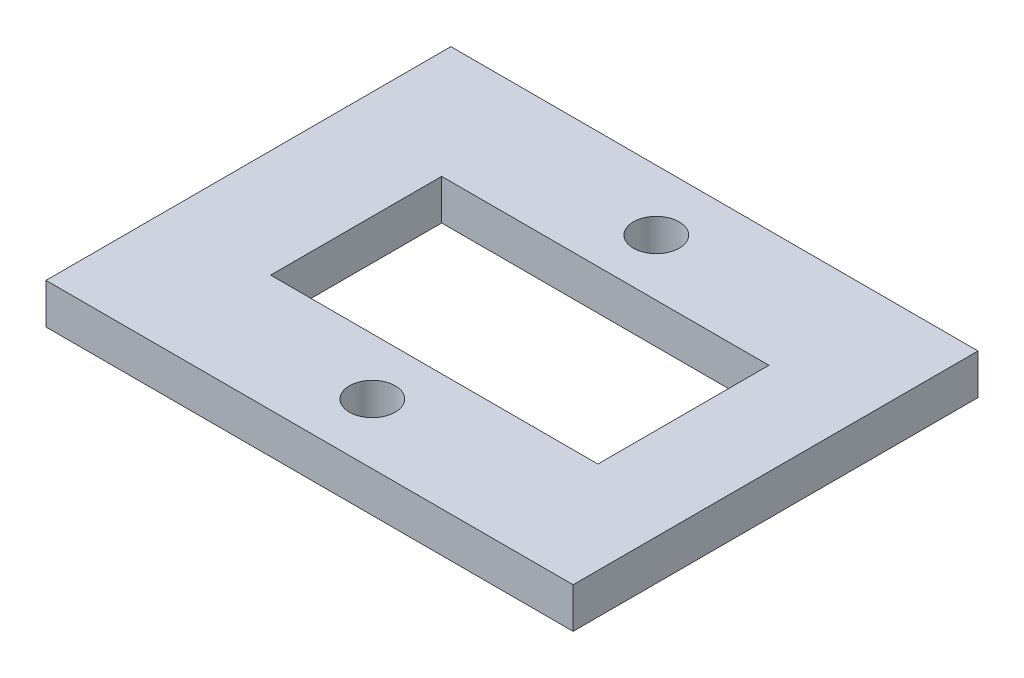
ISO-10303-21;
HEADER;
FILE_DESCRIPTION(('STEP AP214'),'2;1');
FILE_NAME('part.step','',(''),(''),'','','');
FILE_SCHEMA(('AUTOMOTIVE_DESIGN { 1 0 10303 214 1 1 1 1 }'));
ENDSEC;
DATA;
#1=APPLICATION_CONTEXT('core data for automotive mechanical design processes');
#2=APPLICATION_PROTOCOL_DEFINITION('international standard','automotive_design',2000,#1);
#3=PRODUCT_CONTEXT('',#1,'mechanical');
#4=PRODUCT('Part','Part','',(#3));
#5=PRODUCT_RELATED_PRODUCT_CATEGORY('part','',(#4));
#6=PRODUCT_DEFINITION_FORMATION('','',#4);
#7=PRODUCT_DEFINITION_CONTEXT('part definition',#1,'design');
#8=PRODUCT_DEFINITION('design','',#6,#7);
#9=PRODUCT_DEFINITION_SHAPE('','',#8);
#10=(LENGTH_UNIT() NAMED_UNIT(*) SI_UNIT(.MILLI.,.METRE.));
#11=(NAMED_UNIT(*) PLANE_ANGLE_UNIT() SI_UNIT($,.RADIAN.));
#12=(NAMED_UNIT(*) SI_UNIT($,.STERADIAN.) SOLID_ANGLE_UNIT());
#13=UNCERTAINTY_MEASURE_WITH_UNIT(LENGTH_MEASURE(1.E-05),#10,'distance_accuracy_value','');
#14=(GEOMETRIC_REPRESENTATION_CONTEXT(3) GLOBAL_UNCERTAINTY_ASSIGNED_CONTEXT((#13)) GLOBAL_UNIT_ASSIGNED_CONTEXT((#10,
#11,#12)) REPRESENTATION_CONTEXT('',''));
#15=CARTESIAN_POINT('',(0.,0.,0.));
#16=DIRECTION('',(0.,0.,1.));
#17=DIRECTION('',(1.,0.,0.));
#18=AXIS2_PLACEMENT_3D('',#15,#16,#17);
#19=CARTESIAN_POINT('',(0.,1.5,0.));
#20=DIRECTION('',(0.,1.,0.));
#21=DIRECTION('',(0.,0.,1.));
#22=AXIS2_PLACEMENT_3D('',#19,#20,#21);
#23=PLANE('',#22);
#24=CARTESIAN_POINT('',(-0.88776991777709,1.5,-14.9543613464888));
#25=DIRECTION('',(0.,1.,0.));
#26=DIRECTION('',(0.,0.,1.));
#27=AXIS2_PLACEMENT_3D('',#24,#25,#26);
#28=CIRCLE('',#27,1.7);
#29=CARTESIAN_POINT('',(-0.88776991777709,1.5,-13.2543613464888));
#30=VERTEX_POINT('',#29);
#31=EDGE_CURVE('E140',#30,#30,#28,.T.);
#32=ORIENTED_EDGE('',*,*,#31,.F.);
#33=EDGE_LOOP('',(#32));
#34=FACE_BOUND('',#33,.T.);
#35=DIRECTION('',(0.,0.,1.));
#36=VECTOR('',#35,1.);
#37=CARTESIAN_POINT('',(-20.6290016384778,1.5,-19.4420813464888));
#38=LINE('',#37,#36);
#39=CARTESIAN_POINT('',(-20.6290016384778,1.5,-19.4420813464888));
#40=VERTEX_POINT('',#39);
#41=CARTESIAN_POINT('',(-20.6290016384778,1.5,10.6209486535112));
#42=VERTEX_POINT('',#41);
#43=EDGE_CURVE('E156',#40,#42,#38,.T.);
#44=ORIENTED_EDGE('',*,*,#43,.T.);
#45=DIRECTION('',(1.,0.,0.));
#46=VECTOR('',#45,1.);
#47=CARTESIAN_POINT('',(-20.6290016384778,1.5,10.6209486535112));
#48=LINE('',#47,#46);
#49=CARTESIAN_POINT('',(18.5122300822229,1.5,10.6209486535112));
#50=VERTEX_POINT('',#49);
#51=EDGE_CURVE('E160',#42,#50,#48,.T.);
#52=ORIENTED_EDGE('',*,*,#51,.T.);
#53=DIRECTION('',(0.,0.,-1.));
#54=VECTOR('',#53,1.);
#55=CARTESIAN_POINT('',(18.5122300822229,1.5,-19.4420813464888));
#56=LINE('',#55,#54);
#57=CARTESIAN_POINT('',(18.5122300822229,1.5,-19.4420813464888));
#58=VERTEX_POINT('',#57);
#59=EDGE_CURVE('E164',#50,#58,#56,.T.);
#60=ORIENTED_EDGE('',*,*,#59,.T.);
#61=DIRECTION('',(-1.,0.,0.));
#62=VECTOR('',#61,1.);
#63=CARTESIAN_POINT('',(-20.6290016384778,1.5,-19.4420813464888));
#64=LINE('',#63,#62);
#65=EDGE_CURVE('E167',#58,#40,#64,.T.);
#66=ORIENTED_EDGE('',*,*,#65,.T.);
#67=EDGE_LOOP('',(#44,#52,#60,#66));
#68=FACE_BOUND('',#67,.T.);
#69=DIRECTION('',(1.,0.,0.));
#70=VECTOR('',#69,1.);
#71=CARTESIAN_POINT('',(11.6709983615222,1.5,1.94094865351122));
#72=LINE('',#71,#70);
#73=CARTESIAN_POINT('',(-12.6290016384778,1.5,1.94094865351123));
#74=VERTEX_POINT('',#73);
#75=CARTESIAN_POINT('',(11.6709983615222,1.5,1.94094865351122));
#76=VERTEX_POINT('',#75);
#77=EDGE_CURVE('E114',#74,#76,#72,.T.);
#78=ORIENTED_EDGE('',*,*,#77,.F.);
#79=DIRECTION('',(0.,0.,1.));
#80=VECTOR('',#79,1.);
#81=CARTESIAN_POINT('',(-12.6290016384778,1.5,1.94094865351123));
#82=LINE('',#81,#80);
#83=CARTESIAN_POINT('',(-12.6290016384778,1.5,-10.7590513464888));
#84=VERTEX_POINT('',#83);
#85=EDGE_CURVE('E105',#84,#74,#82,.T.);
#86=ORIENTED_EDGE('',*,*,#85,.F.);
#87=DIRECTION('',(-1.,0.,0.));
#88=VECTOR('',#87,1.);
#89=CARTESIAN_POINT('',(-12.6290016384778,1.5,-10.7590513464888));
#90=LINE('',#89,#88);
#91=CARTESIAN_POINT('',(11.6709983615222,1.5,-10.7590513464888));
#92=VERTEX_POINT('',#91);
#93=EDGE_CURVE('E132',#92,#84,#90,.T.);
#94=ORIENTED_EDGE('',*,*,#93,.F.);
#95=DIRECTION('',(0.,0.,-1.));
#96=VECTOR('',#95,1.);
#97=CARTESIAN_POINT('',(11.6709983615222,1.5,1.94094865351122));
#98=LINE('',#97,#96);
#99=EDGE_CURVE('E128',#76,#92,#98,.T.);
#100=ORIENTED_EDGE('',*,*,#99,.F.);
#101=EDGE_LOOP('',(#78,#86,#94,#100));
#102=FACE_BOUND('',#101,.T.);
#103=CARTESIAN_POINT('',(-0.887769917777087,1.5,6.13322865351122));
#104=DIRECTION('',(0.,1.,0.));
#105=DIRECTION('',(0.,0.,1.));
#106=AXIS2_PLACEMENT_3D('',#103,#104,#105);
#107=CIRCLE('',#106,1.7);
#108=CARTESIAN_POINT('',(-0.887769917777087,1.5,7.83322865351122));
#109=VERTEX_POINT('',#108);
#110=EDGE_CURVE('E257',#109,#109,#107,.T.);
#111=ORIENTED_EDGE('',*,*,#110,.F.);
#112=EDGE_LOOP('',(#111));
#113=FACE_BOUND('',#112,.T.);
#114=ADVANCED_FACE('F39',(#34,#68,#102,#113),#23,.T.);
#115=CARTESIAN_POINT('',(0.,-1.5,0.));
#116=DIRECTION('',(0.,1.,0.));
#117=DIRECTION('',(0.,0.,1.));
#118=AXIS2_PLACEMENT_3D('',#115,#116,#117);
#119=PLANE('',#118);
#120=DIRECTION('',(0.,0.,1.));
#121=VECTOR('',#120,1.);
#122=CARTESIAN_POINT('',(-20.6290016384778,-1.5,-19.4420813464888));
#123=LINE('',#122,#121);
#124=CARTESIAN_POINT('',(-20.6290016384778,-1.5,-19.4420813464888));
#125=VERTEX_POINT('',#124);
#126=CARTESIAN_POINT('',(-20.6290016384778,-1.5,10.6209486535112));
#127=VERTEX_POINT('',#126);
#128=EDGE_CURVE('E123',#125,#127,#123,.T.);
#129=ORIENTED_EDGE('',*,*,#128,.F.);
#130=DIRECTION('',(-1.,0.,0.));
#131=VECTOR('',#130,1.);
#132=CARTESIAN_POINT('',(-20.6290016384778,-1.5,-19.4420813464888));
#133=LINE('',#132,#131);
#134=CARTESIAN_POINT('',(18.5122300822229,-1.5,-19.4420813464888));
#135=VERTEX_POINT('',#134);
#136=EDGE_CURVE('E161',#135,#125,#133,.T.);
#137=ORIENTED_EDGE('',*,*,#136,.F.);
#138=DIRECTION('',(0.,0.,-1.));
#139=VECTOR('',#138,1.);
#140=CARTESIAN_POINT('',(18.5122300822229,-1.5,-19.4420813464888));
#141=LINE('',#140,#139);
#142=CARTESIAN_POINT('',(18.5122300822229,-1.5,10.6209486535112));
#143=VERTEX_POINT('',#142);
#144=EDGE_CURVE('E177',#143,#135,#141,.T.);
#145=ORIENTED_EDGE('',*,*,#144,.F.);
#146=DIRECTION('',(1.,0.,0.));
#147=VECTOR('',#146,1.);
#148=CARTESIAN_POINT('',(-20.6290016384778,-1.5,10.6209486535112));
#149=LINE('',#148,#147);
#150=EDGE_CURVE('E174',#127,#143,#149,.T.);
#151=ORIENTED_EDGE('',*,*,#150,.F.);
#152=EDGE_LOOP('',(#129,#137,#145,#151));
#153=FACE_BOUND('',#152,.T.);
#154=DIRECTION('',(0.,0.,1.));
#155=VECTOR('',#154,1.);
#156=CARTESIAN_POINT('',(-12.6290016384778,-1.5,1.94094865351123));
#157=LINE('',#156,#155);
#158=CARTESIAN_POINT('',(-12.6290016384778,-1.5,-10.7590513464888));
#159=VERTEX_POINT('',#158);
#160=CARTESIAN_POINT('',(-12.6290016384778,-1.5,1.94094865351123));
#161=VERTEX_POINT('',#160);
#162=EDGE_CURVE('E63',#159,#161,#157,.T.);
#163=ORIENTED_EDGE('',*,*,#162,.T.);
#164=DIRECTION('',(1.,0.,0.));
#165=VECTOR('',#164,1.);
#166=CARTESIAN_POINT('',(11.6709983615222,-1.5,1.94094865351122));
#167=LINE('',#166,#165);
#168=CARTESIAN_POINT('',(11.6709983615222,-1.5,1.94094865351122));
#169=VERTEX_POINT('',#168);
#170=EDGE_CURVE('E121',#161,#169,#167,.T.);
#171=ORIENTED_EDGE('',*,*,#170,.T.);
#172=DIRECTION('',(0.,0.,-1.));
#173=VECTOR('',#172,1.);
#174=CARTESIAN_POINT('',(11.6709983615222,-1.5,1.94094865351122));
#175=LINE('',#174,#173);
#176=CARTESIAN_POINT('',(11.6709983615222,-1.5,-10.7590513464888));
#177=VERTEX_POINT('',#176);
#178=EDGE_CURVE('E143',#169,#177,#175,.T.);
#179=ORIENTED_EDGE('',*,*,#178,.T.);
#180=DIRECTION('',(-1.,0.,0.));
#181=VECTOR('',#180,1.);
#182=CARTESIAN_POINT('',(-12.6290016384778,-1.5,-10.7590513464888));
#183=LINE('',#182,#181);
#184=EDGE_CURVE('E115',#177,#159,#183,.T.);
#185=ORIENTED_EDGE('',*,*,#184,.T.);
#186=EDGE_LOOP('',(#163,#171,#179,#185));
#187=FACE_BOUND('',#186,.T.);
#188=CARTESIAN_POINT('',(-0.88776991777709,-1.5,-14.9543613464888));
#189=DIRECTION('',(0.,1.,0.));
#190=DIRECTION('',(0.,0.,1.));
#191=AXIS2_PLACEMENT_3D('',#188,#189,#190);
#192=CIRCLE('',#191,1.7);
#193=CARTESIAN_POINT('',(-0.88776991777709,-1.5,-13.2543613464888));
#194=VERTEX_POINT('',#193);
#195=EDGE_CURVE('E265',#194,#194,#192,.T.);
#196=ORIENTED_EDGE('',*,*,#195,.T.);
#197=EDGE_LOOP('',(#196));
#198=FACE_BOUND('',#197,.T.);
#199=CARTESIAN_POINT('',(-0.887769917777087,-1.5,6.13322865351122));
#200=DIRECTION('',(0.,1.,0.));
#201=DIRECTION('',(0.,0.,1.));
#202=AXIS2_PLACEMENT_3D('',#199,#200,#201);
#203=CIRCLE('',#202,1.7);
#204=CARTESIAN_POINT('',(-0.887769917777087,-1.5,7.83322865351122));
#205=VERTEX_POINT('',#204);
#206=EDGE_CURVE('E260',#205,#205,#203,.T.);
#207=ORIENTED_EDGE('',*,*,#206,.T.);
#208=EDGE_LOOP('',(#207));
#209=FACE_BOUND('',#208,.T.);
#210=ADVANCED_FACE('F200',(#153,#187,#198,#209),#119,.F.);
#211=CARTESIAN_POINT('',(-20.6290016384778,1.5,-19.4420813464888));
#212=DIRECTION('',(1.,0.,0.));
#213=DIRECTION('',(0.,0.,-1.));
#214=AXIS2_PLACEMENT_3D('',#211,#212,#213);
#215=PLANE('',#214);
#216=ORIENTED_EDGE('',*,*,#128,.T.);
#217=DIRECTION('',(0.,-1.,0.));
#218=VECTOR('',#217,1.);
#219=CARTESIAN_POINT('',(-20.6290016384778,1.5,10.6209486535112));
#220=LINE('',#219,#218);
#221=EDGE_CURVE('E11',#42,#127,#220,.T.);
#222=ORIENTED_EDGE('',*,*,#221,.F.);
#223=ORIENTED_EDGE('',*,*,#43,.F.);
#224=DIRECTION('',(0.,-1.,0.));
#225=VECTOR('',#224,1.);
#226=CARTESIAN_POINT('',(-20.6290016384778,1.5,-19.4420813464888));
#227=LINE('',#226,#225);
#228=EDGE_CURVE('E170',#40,#125,#227,.T.);
#229=ORIENTED_EDGE('',*,*,#228,.T.);
#230=EDGE_LOOP('',(#216,#222,#223,#229));
#231=FACE_BOUND('',#230,.T.);
#232=ADVANCED_FACE('F41',(#231),#215,.F.);
#233=CARTESIAN_POINT('',(-20.6290016384778,1.5,10.6209486535112));
#234=DIRECTION('',(0.,0.,-1.));
#235=DIRECTION('',(-1.,0.,0.));
#236=AXIS2_PLACEMENT_3D('',#233,#234,#235);
#237=PLANE('',#236);
#238=ORIENTED_EDGE('',*,*,#150,.T.);
#239=DIRECTION('',(0.,-1.,0.));
#240=VECTOR('',#239,1.);
#241=CARTESIAN_POINT('',(18.5122300822229,1.5,10.6209486535112));
#242=LINE('',#241,#240);
#243=EDGE_CURVE('E48',#50,#143,#242,.T.);
#244=ORIENTED_EDGE('',*,*,#243,.F.);
#245=ORIENTED_EDGE('',*,*,#51,.F.);
#246=ORIENTED_EDGE('',*,*,#221,.T.);
#247=EDGE_LOOP('',(#238,#244,#245,#246));
#248=FACE_BOUND('',#247,.T.);
#249=ADVANCED_FACE('F210',(#248),#237,.F.);
#250=CARTESIAN_POINT('',(18.5122300822229,1.5,-19.4420813464888));
#251=DIRECTION('',(-1.,0.,0.));
#252=DIRECTION('',(0.,0.,1.));
#253=AXIS2_PLACEMENT_3D('',#250,#251,#252);
#254=PLANE('',#253);
#255=ORIENTED_EDGE('',*,*,#144,.T.);
#256=DIRECTION('',(0.,-1.,0.));
#257=VECTOR('',#256,1.);
#258=CARTESIAN_POINT('',(18.5122300822229,1.5,-19.4420813464888));
#259=LINE('',#258,#257);
#260=EDGE_CURVE('E185',#58,#135,#259,.T.);
#261=ORIENTED_EDGE('',*,*,#260,.F.);
#262=ORIENTED_EDGE('',*,*,#59,.F.);
#263=ORIENTED_EDGE('',*,*,#243,.T.);
#264=EDGE_LOOP('',(#255,#261,#262,#263));
#265=FACE_BOUND('',#264,.T.);
#266=ADVANCED_FACE('F194',(#265),#254,.F.);
#267=CARTESIAN_POINT('',(-20.6290016384778,1.5,-19.4420813464888));
#268=DIRECTION('',(0.,0.,1.));
#269=DIRECTION('',(1.,0.,0.));
#270=AXIS2_PLACEMENT_3D('',#267,#268,#269);
#271=PLANE('',#270);
#272=ORIENTED_EDGE('',*,*,#136,.T.);
#273=ORIENTED_EDGE('',*,*,#228,.F.);
#274=ORIENTED_EDGE('',*,*,#65,.F.);
#275=ORIENTED_EDGE('',*,*,#260,.T.);
#276=EDGE_LOOP('',(#272,#273,#274,#275));
#277=FACE_BOUND('',#276,.T.);
#278=ADVANCED_FACE('F204',(#277),#271,.F.);
#279=CARTESIAN_POINT('',(-12.6290016384778,1.5,1.94094865351123));
#280=DIRECTION('',(1.,0.,0.));
#281=DIRECTION('',(0.,0.,-1.));
#282=AXIS2_PLACEMENT_3D('',#279,#280,#281);
#283=PLANE('',#282);
#284=ORIENTED_EDGE('',*,*,#162,.F.);
#285=DIRECTION('',(0.,-1.,0.));
#286=VECTOR('',#285,1.);
#287=CARTESIAN_POINT('',(-12.6290016384778,1.5,-10.7590513464888));
#288=LINE('',#287,#286);
#289=EDGE_CURVE('E109',#84,#159,#288,.T.);
#290=ORIENTED_EDGE('',*,*,#289,.F.);
#291=ORIENTED_EDGE('',*,*,#85,.T.);
#292=DIRECTION('',(0.,-1.,0.));
#293=VECTOR('',#292,1.);
#294=CARTESIAN_POINT('',(-12.6290016384778,1.5,1.94094865351123));
#295=LINE('',#294,#293);
#296=EDGE_CURVE('E108',#74,#161,#295,.T.);
#297=ORIENTED_EDGE('',*,*,#296,.T.);
#298=EDGE_LOOP('',(#284,#290,#291,#297));
#299=FACE_BOUND('',#298,.T.);
#300=ADVANCED_FACE('F107',(#299),#283,.T.);
#301=CARTESIAN_POINT('',(11.6709983615222,1.5,1.94094865351122));
#302=DIRECTION('',(0.,0.,-1.));
#303=DIRECTION('',(-1.,0.,0.));
#304=AXIS2_PLACEMENT_3D('',#301,#302,#303);
#305=PLANE('',#304);
#306=ORIENTED_EDGE('',*,*,#170,.F.);
#307=ORIENTED_EDGE('',*,*,#296,.F.);
#308=ORIENTED_EDGE('',*,*,#77,.T.);
#309=DIRECTION('',(0.,-1.,0.));
#310=VECTOR('',#309,1.);
#311=CARTESIAN_POINT('',(11.6709983615222,1.5,1.94094865351122));
#312=LINE('',#311,#310);
#313=EDGE_CURVE('E124',#76,#169,#312,.T.);
#314=ORIENTED_EDGE('',*,*,#313,.T.);
#315=EDGE_LOOP('',(#306,#307,#308,#314));
#316=FACE_BOUND('',#315,.T.);
#317=ADVANCED_FACE('F118',(#316),#305,.T.);
#318=CARTESIAN_POINT('',(11.6709983615222,1.5,1.94094865351122));
#319=DIRECTION('',(-1.,0.,0.));
#320=DIRECTION('',(0.,0.,1.));
#321=AXIS2_PLACEMENT_3D('',#318,#319,#320);
#322=PLANE('',#321);
#323=ORIENTED_EDGE('',*,*,#178,.F.);
#324=ORIENTED_EDGE('',*,*,#313,.F.);
#325=ORIENTED_EDGE('',*,*,#99,.T.);
#326=DIRECTION('',(0.,-1.,0.));
#327=VECTOR('',#326,1.);
#328=CARTESIAN_POINT('',(11.6709983615222,1.5,-10.7590513464888));
#329=LINE('',#328,#327);
#330=EDGE_CURVE('E55',#92,#177,#329,.T.);
#331=ORIENTED_EDGE('',*,*,#330,.T.);
#332=EDGE_LOOP('',(#323,#324,#325,#331));
#333=FACE_BOUND('',#332,.T.);
#334=ADVANCED_FACE('F235',(#333),#322,.T.);
#335=CARTESIAN_POINT('',(-12.6290016384778,1.5,-10.7590513464888));
#336=DIRECTION('',(0.,0.,1.));
#337=DIRECTION('',(1.,0.,0.));
#338=AXIS2_PLACEMENT_3D('',#335,#336,#337);
#339=PLANE('',#338);
#340=ORIENTED_EDGE('',*,*,#184,.F.);
#341=ORIENTED_EDGE('',*,*,#330,.F.);
#342=ORIENTED_EDGE('',*,*,#93,.T.);
#343=ORIENTED_EDGE('',*,*,#289,.T.);
#344=EDGE_LOOP('',(#340,#341,#342,#343));
#345=FACE_BOUND('',#344,.T.);
#346=ADVANCED_FACE('F239',(#345),#339,.T.);
#347=CARTESIAN_POINT('',(-0.88776991777709,1.5,-14.9543613464888));
#348=DIRECTION('',(0.,-1.,0.));
#349=DIRECTION('',(0.,0.,-1.));
#350=AXIS2_PLACEMENT_3D('',#347,#348,#349);
#351=CYLINDRICAL_SURFACE('',#350,1.7);
#352=ORIENTED_EDGE('',*,*,#31,.T.);
#353=EDGE_LOOP('',(#352));
#354=FACE_BOUND('',#353,.T.);
#355=ORIENTED_EDGE('',*,*,#195,.F.);
#356=EDGE_LOOP('',(#355));
#357=FACE_BOUND('',#356,.T.);
#358=ADVANCED_FACE('F245',(#354,#357),#351,.F.);
#359=CARTESIAN_POINT('',(-0.887769917777087,1.5,6.13322865351122));
#360=DIRECTION('',(0.,-1.,0.));
#361=DIRECTION('',(0.,0.,-1.));
#362=AXIS2_PLACEMENT_3D('',#359,#360,#361);
#363=CYLINDRICAL_SURFACE('',#362,1.7);
#364=ORIENTED_EDGE('',*,*,#110,.T.);
#365=EDGE_LOOP('',(#364));
#366=FACE_BOUND('',#365,.T.);
#367=ORIENTED_EDGE('',*,*,#206,.F.);
#368=EDGE_LOOP('',(#367));
#369=FACE_BOUND('',#368,.T.);
#370=ADVANCED_FACE('F248',(#366,#369),#363,.F.);
#371=CLOSED_SHELL('',(#114,#210,#232,#249,#266,#278,#300,#317,#334,#346,#358,#370));
#372=MANIFOLD_SOLID_BREP('B2',#371);
#373=ADVANCED_BREP_SHAPE_REPRESENTATION('',(#18,#372),#14);
#374=SHAPE_DEFINITION_REPRESENTATION(#9,#373);
ENDSEC;
END-ISO-10303-21;
